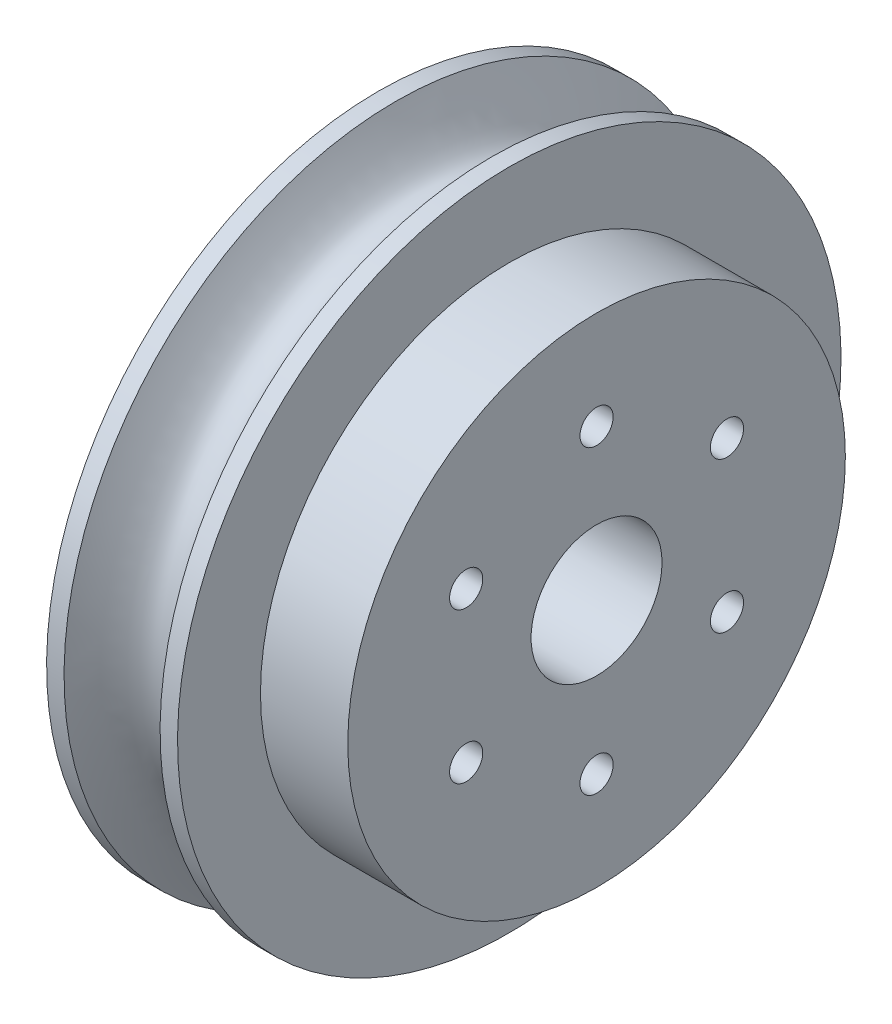
ISO-10303-21;
HEADER;
FILE_DESCRIPTION(('STEP AP214'),'2;1');
FILE_NAME('part.step','',(''),(''),'','','');
FILE_SCHEMA(('AUTOMOTIVE_DESIGN { 1 0 10303 214 1 1 1 1 }'));
ENDSEC;
DATA;
#1=APPLICATION_CONTEXT('core data for automotive mechanical design processes');
#2=APPLICATION_PROTOCOL_DEFINITION('international standard','automotive_design',2000,#1);
#3=PRODUCT_CONTEXT('',#1,'mechanical');
#4=PRODUCT('Part','Part','',(#3));
#5=PRODUCT_RELATED_PRODUCT_CATEGORY('part','',(#4));
#6=PRODUCT_DEFINITION_FORMATION('','',#4);
#7=PRODUCT_DEFINITION_CONTEXT('part definition',#1,'design');
#8=PRODUCT_DEFINITION('design','',#6,#7);
#9=PRODUCT_DEFINITION_SHAPE('','',#8);
#10=(LENGTH_UNIT() NAMED_UNIT(*) SI_UNIT(.MILLI.,.METRE.));
#11=(NAMED_UNIT(*) PLANE_ANGLE_UNIT() SI_UNIT($,.RADIAN.));
#12=(NAMED_UNIT(*) SI_UNIT($,.STERADIAN.) SOLID_ANGLE_UNIT());
#13=UNCERTAINTY_MEASURE_WITH_UNIT(LENGTH_MEASURE(1.E-05),#10,'distance_accuracy_value','');
#14=(GEOMETRIC_REPRESENTATION_CONTEXT(3) GLOBAL_UNCERTAINTY_ASSIGNED_CONTEXT((#13)) GLOBAL_UNIT_ASSIGNED_CONTEXT((#10,
#11,#12)) REPRESENTATION_CONTEXT('',''));
#15=CARTESIAN_POINT('',(0.,0.,0.));
#16=DIRECTION('',(0.,0.,1.));
#17=DIRECTION('',(1.,0.,0.));
#18=AXIS2_PLACEMENT_3D('',#15,#16,#17);
#19=CARTESIAN_POINT('',(10.,17.25,0.));
#20=DIRECTION('',(-1.,0.,0.));
#21=DIRECTION('',(0.,0.,1.));
#22=AXIS2_PLACEMENT_3D('',#19,#20,#21);
#23=CYLINDRICAL_SURFACE('',#22,1.9);
#24=CARTESIAN_POINT('',(10.,17.25,0.));
#25=DIRECTION('',(1.,0.,0.));
#26=DIRECTION('',(0.,0.,-1.));
#27=AXIS2_PLACEMENT_3D('',#24,#25,#26);
#28=CIRCLE('',#27,1.9);
#29=CARTESIAN_POINT('',(10.,17.25,-1.9));
#30=VERTEX_POINT('',#29);
#31=EDGE_CURVE('E49',#30,#30,#28,.T.);
#32=ORIENTED_EDGE('',*,*,#31,.T.);
#33=EDGE_LOOP('',(#32));
#34=FACE_BOUND('',#33,.T.);
#35=CARTESIAN_POINT('',(-10.,17.25,0.));
#36=DIRECTION('',(-1.,0.,0.));
#37=DIRECTION('',(0.,-1.,0.));
#38=AXIS2_PLACEMENT_3D('',#35,#36,#37);
#39=CIRCLE('',#38,1.9);
#40=CARTESIAN_POINT('',(-10.,15.35,0.));
#41=VERTEX_POINT('',#40);
#42=EDGE_CURVE('E44',#41,#41,#39,.T.);
#43=ORIENTED_EDGE('',*,*,#42,.T.);
#44=EDGE_LOOP('',(#43));
#45=FACE_BOUND('',#44,.T.);
#46=ADVANCED_FACE('F40',(#34,#45),#23,.F.);
#47=CARTESIAN_POINT('',(10.,8.62500000000001,-14.9389382152816));
#48=DIRECTION('',(-1.,0.,0.));
#49=DIRECTION('',(0.,0.,1.));
#50=AXIS2_PLACEMENT_3D('',#47,#48,#49);
#51=CYLINDRICAL_SURFACE('',#50,1.90000000000071);
#52=CARTESIAN_POINT('',(10.,8.62500000000001,-14.9389382152816));
#53=DIRECTION('',(1.,0.,0.));
#54=DIRECTION('',(0.,0.,-1.));
#55=AXIS2_PLACEMENT_3D('',#52,#53,#54);
#56=CIRCLE('',#55,1.90000000000071);
#57=CARTESIAN_POINT('',(10.,8.62500000000001,-16.8389382152823));
#58=VERTEX_POINT('',#57);
#59=EDGE_CURVE('E181',#58,#58,#56,.T.);
#60=ORIENTED_EDGE('',*,*,#59,.T.);
#61=EDGE_LOOP('',(#60));
#62=FACE_BOUND('',#61,.T.);
#63=CARTESIAN_POINT('',(-10.,8.62500000000001,-14.9389382152816));
#64=DIRECTION('',(-1.,0.,0.));
#65=DIRECTION('',(0.,-1.,0.));
#66=AXIS2_PLACEMENT_3D('',#63,#64,#65);
#67=CIRCLE('',#66,1.90000000000071);
#68=CARTESIAN_POINT('',(-10.,6.7249999999993,-14.9389382152816));
#69=VERTEX_POINT('',#68);
#70=EDGE_CURVE('E81',#69,#69,#67,.T.);
#71=ORIENTED_EDGE('',*,*,#70,.T.);
#72=EDGE_LOOP('',(#71));
#73=FACE_BOUND('',#72,.T.);
#74=ADVANCED_FACE('F149',(#62,#73),#51,.F.);
#75=CARTESIAN_POINT('',(10.,-8.625,-14.9389382152816));
#76=DIRECTION('',(-1.,0.,0.));
#77=DIRECTION('',(0.,0.,1.));
#78=AXIS2_PLACEMENT_3D('',#75,#76,#77);
#79=CYLINDRICAL_SURFACE('',#78,1.90000000000165);
#80=CARTESIAN_POINT('',(10.,-8.625,-14.9389382152816));
#81=DIRECTION('',(1.,0.,0.));
#82=DIRECTION('',(0.,0.,-1.));
#83=AXIS2_PLACEMENT_3D('',#80,#81,#82);
#84=CIRCLE('',#83,1.90000000000165);
#85=CARTESIAN_POINT('',(10.,-8.625,-16.8389382152832));
#86=VERTEX_POINT('',#85);
#87=EDGE_CURVE('E172',#86,#86,#84,.T.);
#88=ORIENTED_EDGE('',*,*,#87,.T.);
#89=EDGE_LOOP('',(#88));
#90=FACE_BOUND('',#89,.T.);
#91=CARTESIAN_POINT('',(-10.,-8.625,-14.9389382152816));
#92=DIRECTION('',(-1.,0.,0.));
#93=DIRECTION('',(0.,-1.,0.));
#94=AXIS2_PLACEMENT_3D('',#91,#92,#93);
#95=CIRCLE('',#94,1.90000000000165);
#96=CARTESIAN_POINT('',(-10.,-10.5250000000016,-14.9389382152816));
#97=VERTEX_POINT('',#96);
#98=EDGE_CURVE('E78',#97,#97,#95,.T.);
#99=ORIENTED_EDGE('',*,*,#98,.T.);
#100=EDGE_LOOP('',(#99));
#101=FACE_BOUND('',#100,.T.);
#102=ADVANCED_FACE('F145',(#90,#101),#79,.F.);
#103=CARTESIAN_POINT('',(10.,-17.25,0.));
#104=DIRECTION('',(-1.,0.,0.));
#105=DIRECTION('',(0.,0.,1.));
#106=AXIS2_PLACEMENT_3D('',#103,#104,#105);
#107=CYLINDRICAL_SURFACE('',#106,1.90000000000187);
#108=CARTESIAN_POINT('',(10.,-17.25,0.));
#109=DIRECTION('',(1.,0.,0.));
#110=DIRECTION('',(0.,0.,-1.));
#111=AXIS2_PLACEMENT_3D('',#108,#109,#110);
#112=CIRCLE('',#111,1.90000000000187);
#113=CARTESIAN_POINT('',(10.,-17.25,-1.90000000000187));
#114=VERTEX_POINT('',#113);
#115=EDGE_CURVE('E185',#114,#114,#112,.T.);
#116=ORIENTED_EDGE('',*,*,#115,.T.);
#117=EDGE_LOOP('',(#116));
#118=FACE_BOUND('',#117,.T.);
#119=CARTESIAN_POINT('',(-10.,-17.25,0.));
#120=DIRECTION('',(-1.,0.,0.));
#121=DIRECTION('',(0.,-1.,0.));
#122=AXIS2_PLACEMENT_3D('',#119,#120,#121);
#123=CIRCLE('',#122,1.90000000000187);
#124=CARTESIAN_POINT('',(-10.,-19.1500000000019,0.));
#125=VERTEX_POINT('',#124);
#126=EDGE_CURVE('E74',#125,#125,#123,.T.);
#127=ORIENTED_EDGE('',*,*,#126,.T.);
#128=EDGE_LOOP('',(#127));
#129=FACE_BOUND('',#128,.T.);
#130=ADVANCED_FACE('F141',(#118,#129),#107,.F.);
#131=CARTESIAN_POINT('',(10.,-8.62500000000001,14.9389382152816));
#132=DIRECTION('',(-1.,0.,0.));
#133=DIRECTION('',(0.,0.,1.));
#134=AXIS2_PLACEMENT_3D('',#131,#132,#133);
#135=CYLINDRICAL_SURFACE('',#134,1.90000000000115);
#136=CARTESIAN_POINT('',(10.,-8.62500000000001,14.9389382152816));
#137=DIRECTION('',(1.,0.,0.));
#138=DIRECTION('',(0.,0.,-1.));
#139=AXIS2_PLACEMENT_3D('',#136,#137,#138);
#140=CIRCLE('',#139,1.90000000000115);
#141=CARTESIAN_POINT('',(10.,-8.62500000000001,13.0389382152804));
#142=VERTEX_POINT('',#141);
#143=EDGE_CURVE('E168',#142,#142,#140,.T.);
#144=ORIENTED_EDGE('',*,*,#143,.T.);
#145=EDGE_LOOP('',(#144));
#146=FACE_BOUND('',#145,.T.);
#147=CARTESIAN_POINT('',(-10.,-8.62500000000001,14.9389382152816));
#148=DIRECTION('',(-1.,0.,0.));
#149=DIRECTION('',(0.,-1.,0.));
#150=AXIS2_PLACEMENT_3D('',#147,#148,#149);
#151=CIRCLE('',#150,1.90000000000115);
#152=CARTESIAN_POINT('',(-10.,-10.5250000000012,14.9389382152816));
#153=VERTEX_POINT('',#152);
#154=EDGE_CURVE('E69',#153,#153,#151,.T.);
#155=ORIENTED_EDGE('',*,*,#154,.T.);
#156=EDGE_LOOP('',(#155));
#157=FACE_BOUND('',#156,.T.);
#158=ADVANCED_FACE('F137',(#146,#157),#135,.F.);
#159=CARTESIAN_POINT('',(10.,8.62499999999999,14.9389382152816));
#160=DIRECTION('',(-1.,0.,0.));
#161=DIRECTION('',(0.,0.,1.));
#162=AXIS2_PLACEMENT_3D('',#159,#160,#161);
#163=CYLINDRICAL_SURFACE('',#162,1.90000000000022);
#164=CARTESIAN_POINT('',(10.,8.62499999999999,14.9389382152816));
#165=DIRECTION('',(1.,0.,0.));
#166=DIRECTION('',(0.,0.,-1.));
#167=AXIS2_PLACEMENT_3D('',#164,#165,#166);
#168=CIRCLE('',#167,1.90000000000022);
#169=CARTESIAN_POINT('',(10.,8.62499999999999,13.0389382152814));
#170=VERTEX_POINT('',#169);
#171=EDGE_CURVE('E63',#170,#170,#168,.T.);
#172=ORIENTED_EDGE('',*,*,#171,.T.);
#173=EDGE_LOOP('',(#172));
#174=FACE_BOUND('',#173,.T.);
#175=CARTESIAN_POINT('',(-10.,8.62499999999999,14.9389382152816));
#176=DIRECTION('',(-1.,0.,0.));
#177=DIRECTION('',(0.,-1.,0.));
#178=AXIS2_PLACEMENT_3D('',#175,#176,#177);
#179=CIRCLE('',#178,1.90000000000022);
#180=CARTESIAN_POINT('',(-10.,6.72499999999977,14.9389382152816));
#181=VERTEX_POINT('',#180);
#182=EDGE_CURVE('E65',#181,#181,#179,.T.);
#183=ORIENTED_EDGE('',*,*,#182,.T.);
#184=EDGE_LOOP('',(#183));
#185=FACE_BOUND('',#184,.T.);
#186=ADVANCED_FACE('F133',(#174,#185),#163,.F.);
#187=CARTESIAN_POINT('',(10.,0.,0.));
#188=DIRECTION('',(1.,0.,0.));
#189=DIRECTION('',(0.,0.,-1.));
#190=AXIS2_PLACEMENT_3D('',#187,#188,#189);
#191=PLANE('',#190);
#192=ORIENTED_EDGE('',*,*,#143,.F.);
#193=EDGE_LOOP('',(#192));
#194=FACE_BOUND('',#193,.T.);
#195=ORIENTED_EDGE('',*,*,#87,.F.);
#196=EDGE_LOOP('',(#195));
#197=FACE_BOUND('',#196,.T.);
#198=CARTESIAN_POINT('',(10.,0.,0.));
#199=DIRECTION('',(1.,0.,0.));
#200=DIRECTION('',(0.,0.,-1.));
#201=AXIS2_PLACEMENT_3D('',#198,#199,#200);
#202=CIRCLE('',#201,7.5);
#203=CARTESIAN_POINT('',(10.,0.,-7.5));
#204=VERTEX_POINT('',#203);
#205=EDGE_CURVE('E55',#204,#204,#202,.T.);
#206=ORIENTED_EDGE('',*,*,#205,.F.);
#207=EDGE_LOOP('',(#206));
#208=FACE_BOUND('',#207,.T.);
#209=CARTESIAN_POINT('',(10.,0.,0.));
#210=DIRECTION('',(1.,0.,0.));
#211=DIRECTION('',(0.,0.,-1.));
#212=AXIS2_PLACEMENT_3D('',#209,#210,#211);
#213=CIRCLE('',#212,28.5);
#214=CARTESIAN_POINT('',(10.,0.,-28.5));
#215=VERTEX_POINT('',#214);
#216=EDGE_CURVE('E10',#215,#215,#213,.T.);
#217=ORIENTED_EDGE('',*,*,#216,.T.);
#218=EDGE_LOOP('',(#217));
#219=FACE_BOUND('',#218,.T.);
#220=ORIENTED_EDGE('',*,*,#31,.F.);
#221=EDGE_LOOP('',(#220));
#222=FACE_BOUND('',#221,.T.);
#223=ORIENTED_EDGE('',*,*,#59,.F.);
#224=EDGE_LOOP('',(#223));
#225=FACE_BOUND('',#224,.T.);
#226=ORIENTED_EDGE('',*,*,#115,.F.);
#227=EDGE_LOOP('',(#226));
#228=FACE_BOUND('',#227,.T.);
#229=ORIENTED_EDGE('',*,*,#171,.F.);
#230=EDGE_LOOP('',(#229));
#231=FACE_BOUND('',#230,.T.);
#232=ADVANCED_FACE('F136',(#194,#197,#208,#219,#222,#225,#228,#231),#191,.T.);
#233=CARTESIAN_POINT('',(10.,0.,0.));
#234=DIRECTION('',(-1.,0.,0.));
#235=DIRECTION('',(0.,0.,1.));
#236=AXIS2_PLACEMENT_3D('',#233,#234,#235);
#237=CYLINDRICAL_SURFACE('',#236,28.5);
#238=ORIENTED_EDGE('',*,*,#216,.F.);
#239=EDGE_LOOP('',(#238));
#240=FACE_BOUND('',#239,.T.);
#241=CARTESIAN_POINT('',(0.,0.,0.));
#242=DIRECTION('',(1.,0.,0.));
#243=DIRECTION('',(0.,0.,-1.));
#244=AXIS2_PLACEMENT_3D('',#241,#242,#243);
#245=CIRCLE('',#244,28.5);
#246=CARTESIAN_POINT('',(0.,0.,-28.5));
#247=VERTEX_POINT('',#246);
#248=EDGE_CURVE('E59',#247,#247,#245,.T.);
#249=ORIENTED_EDGE('',*,*,#248,.T.);
#250=EDGE_LOOP('',(#249));
#251=FACE_BOUND('',#250,.T.);
#252=ADVANCED_FACE('F42',(#240,#251),#237,.T.);
#253=CARTESIAN_POINT('',(10.,0.,0.));
#254=DIRECTION('',(-1.,0.,0.));
#255=DIRECTION('',(0.,0.,1.));
#256=AXIS2_PLACEMENT_3D('',#253,#254,#255);
#257=CYLINDRICAL_SURFACE('',#256,7.5);
#258=ORIENTED_EDGE('',*,*,#205,.T.);
#259=EDGE_LOOP('',(#258));
#260=FACE_BOUND('',#259,.T.);
#261=CARTESIAN_POINT('',(-15.,0.,0.));
#262=DIRECTION('',(1.,0.,0.));
#263=DIRECTION('',(0.,0.,-1.));
#264=AXIS2_PLACEMENT_3D('',#261,#262,#263);
#265=CIRCLE('',#264,7.5);
#266=CARTESIAN_POINT('',(-15.,0.,-7.5));
#267=VERTEX_POINT('',#266);
#268=EDGE_CURVE('E88',#267,#267,#265,.T.);
#269=ORIENTED_EDGE('',*,*,#268,.F.);
#270=EDGE_LOOP('',(#269));
#271=FACE_BOUND('',#270,.T.);
#272=ADVANCED_FACE('F131',(#260,#271),#257,.F.);
#273=CARTESIAN_POINT('',(0.,38.,0.));
#274=DIRECTION('',(1.,0.,0.));
#275=DIRECTION('',(0.,1.,0.));
#276=AXIS2_PLACEMENT_3D('',#273,#274,#275);
#277=PLANE('',#276);
#278=ORIENTED_EDGE('',*,*,#248,.F.);
#279=EDGE_LOOP('',(#278));
#280=FACE_BOUND('',#279,.T.);
#281=CARTESIAN_POINT('',(0.,0.,0.));
#282=DIRECTION('',(1.,0.,0.));
#283=DIRECTION('',(0.,1.,0.));
#284=AXIS2_PLACEMENT_3D('',#281,#282,#283);
#285=CIRCLE('',#284,38.);
#286=CARTESIAN_POINT('',(0.,38.,0.));
#287=VERTEX_POINT('',#286);
#288=EDGE_CURVE('E93',#287,#287,#285,.T.);
#289=ORIENTED_EDGE('',*,*,#288,.T.);
#290=EDGE_LOOP('',(#289));
#291=FACE_BOUND('',#290,.T.);
#292=ADVANCED_FACE('F127',(#280,#291),#277,.T.);
#293=CARTESIAN_POINT('',(-15.,38.,0.));
#294=DIRECTION('',(-1.,0.,0.));
#295=DIRECTION('',(0.,-1.,0.));
#296=AXIS2_PLACEMENT_3D('',#293,#294,#295);
#297=PLANE('',#296);
#298=CARTESIAN_POINT('',(-15.,17.2499999999992,-4.88193243858465E-13));
#299=DIRECTION('',(-1.,0.,0.));
#300=DIRECTION('',(0.,-1.,0.));
#301=AXIS2_PLACEMENT_3D('',#298,#299,#300);
#302=CIRCLE('',#301,4.00000000000097);
#303=CARTESIAN_POINT('',(-15.,13.2499999999982,-4.88193243858465E-13));
#304=VERTEX_POINT('',#303);
#305=EDGE_CURVE('E240',#304,#304,#302,.T.);
#306=ORIENTED_EDGE('',*,*,#305,.F.);
#307=EDGE_LOOP('',(#306));
#308=FACE_BOUND('',#307,.T.);
#309=CARTESIAN_POINT('',(-15.,8.62499999999834,-14.9389382152816));
#310=DIRECTION('',(-1.,0.,0.));
#311=DIRECTION('',(0.,-1.,0.));
#312=AXIS2_PLACEMENT_3D('',#309,#310,#311);
#313=CIRCLE('',#312,4.00000000000116);
#314=CARTESIAN_POINT('',(-15.,4.62499999999717,-14.9389382152816));
#315=VERTEX_POINT('',#314);
#316=EDGE_CURVE('E232',#315,#315,#313,.T.);
#317=ORIENTED_EDGE('',*,*,#316,.F.);
#318=EDGE_LOOP('',(#317));
#319=FACE_BOUND('',#318,.T.);
#320=CARTESIAN_POINT('',(-15.,-8.62500000000167,-14.9389382152806));
#321=DIRECTION('',(-1.,0.,0.));
#322=DIRECTION('',(0.,-1.,0.));
#323=AXIS2_PLACEMENT_3D('',#320,#321,#322);
#324=CIRCLE('',#323,4.00000000000045);
#325=CARTESIAN_POINT('',(-15.,-12.6250000000021,-14.9389382152806));
#326=VERTEX_POINT('',#325);
#327=EDGE_CURVE('E217',#326,#326,#324,.T.);
#328=ORIENTED_EDGE('',*,*,#327,.F.);
#329=EDGE_LOOP('',(#328));
#330=FACE_BOUND('',#329,.T.);
#331=CARTESIAN_POINT('',(-15.,8.62499999999999,14.9389382152816));
#332=DIRECTION('',(-1.,0.,0.));
#333=DIRECTION('',(0.,-1.,0.));
#334=AXIS2_PLACEMENT_3D('',#331,#332,#333);
#335=CIRCLE('',#334,4.);
#336=CARTESIAN_POINT('',(-15.,4.62499999999999,14.9389382152816));
#337=VERTEX_POINT('',#336);
#338=EDGE_CURVE('E216',#337,#337,#335,.T.);
#339=ORIENTED_EDGE('',*,*,#338,.F.);
#340=EDGE_LOOP('',(#339));
#341=FACE_BOUND('',#340,.T.);
#342=CARTESIAN_POINT('',(-15.,-17.2500000000008,1.43275017652784E-12));
#343=DIRECTION('',(-1.,0.,0.));
#344=DIRECTION('',(0.,-1.,0.));
#345=AXIS2_PLACEMENT_3D('',#342,#343,#344);
#346=CIRCLE('',#345,3.99999999999952);
#347=CARTESIAN_POINT('',(-15.,-21.2500000000004,1.43275017652784E-12));
#348=VERTEX_POINT('',#347);
#349=EDGE_CURVE('E254',#348,#348,#346,.T.);
#350=ORIENTED_EDGE('',*,*,#349,.F.);
#351=EDGE_LOOP('',(#350));
#352=FACE_BOUND('',#351,.T.);
#353=CARTESIAN_POINT('',(-15.,-8.62500000000001,14.9389382152825));
#354=DIRECTION('',(-1.,0.,0.));
#355=DIRECTION('',(0.,-1.,0.));
#356=AXIS2_PLACEMENT_3D('',#353,#354,#355);
#357=CIRCLE('',#356,3.9999999999993);
#358=CARTESIAN_POINT('',(-15.,-12.6249999999993,14.9389382152825));
#359=VERTEX_POINT('',#358);
#360=EDGE_CURVE('E103',#359,#359,#357,.T.);
#361=ORIENTED_EDGE('',*,*,#360,.F.);
#362=EDGE_LOOP('',(#361));
#363=FACE_BOUND('',#362,.T.);
#364=ORIENTED_EDGE('',*,*,#268,.T.);
#365=EDGE_LOOP('',(#364));
#366=FACE_BOUND('',#365,.T.);
#367=CARTESIAN_POINT('',(-15.,0.,0.));
#368=DIRECTION('',(1.,0.,0.));
#369=DIRECTION('',(0.,1.,0.));
#370=AXIS2_PLACEMENT_3D('',#367,#368,#369);
#371=CIRCLE('',#370,38.);
#372=CARTESIAN_POINT('',(-15.,38.,0.));
#373=VERTEX_POINT('',#372);
#374=EDGE_CURVE('E64',#373,#373,#371,.T.);
#375=ORIENTED_EDGE('',*,*,#374,.F.);
#376=EDGE_LOOP('',(#375));
#377=FACE_BOUND('',#376,.T.);
#378=ADVANCED_FACE('F123',(#308,#319,#330,#341,#352,#363,#366,#377),#297,.T.);
#379=CARTESIAN_POINT('',(0.,0.,0.));
#380=DIRECTION('',(1.,0.,0.));
#381=DIRECTION('',(0.,1.,0.));
#382=AXIS2_PLACEMENT_3D('',#379,#380,#381);
#383=CYLINDRICAL_SURFACE('',#382,38.);
#384=ORIENTED_EDGE('',*,*,#374,.T.);
#385=EDGE_LOOP('',(#384));
#386=FACE_BOUND('',#385,.T.);
#387=CARTESIAN_POINT('',(-13.,0.,0.));
#388=DIRECTION('',(1.,0.,0.));
#389=DIRECTION('',(0.,1.,0.));
#390=AXIS2_PLACEMENT_3D('',#387,#388,#389);
#391=CIRCLE('',#390,38.);
#392=CARTESIAN_POINT('',(-13.,38.,0.));
#393=VERTEX_POINT('',#392);
#394=EDGE_CURVE('E281',#393,#393,#391,.T.);
#395=ORIENTED_EDGE('',*,*,#394,.F.);
#396=EDGE_LOOP('',(#395));
#397=FACE_BOUND('',#396,.T.);
#398=ADVANCED_FACE('F118',(#386,#397),#383,.T.);
#399=CARTESIAN_POINT('',(-2.,38.,0.));
#400=CARTESIAN_POINT('',(-5.0030564973437,32.05288023347,0.));
#401=CARTESIAN_POINT('',(-7.51549542219769,32.0193038111847,0.));
#402=CARTESIAN_POINT('',(-9.9770669763408,32.0395767366144,0.));
#403=CARTESIAN_POINT('',(-13.,38.,0.));
#404=B_SPLINE_CURVE_WITH_KNOTS('',3,(#399,#400,#401,#402,#403),.UNSPECIFIED.,.F.,.F.,(4,1,4),
(0.0480518872990736,0.499495068774425,0.951948112694929),.UNSPECIFIED.);
#405=CARTESIAN_POINT('',(0.,0.,0.));
#406=DIRECTION('',(1.,0.,0.));
#407=AXIS1_PLACEMENT('',#405,#406);
#408=SURFACE_OF_REVOLUTION('',#404,#407);
#409=ORIENTED_EDGE('',*,*,#394,.T.);
#410=EDGE_LOOP('',(#409));
#411=FACE_BOUND('',#410,.T.);
#412=CARTESIAN_POINT('',(-1.99999999999999,0.,0.));
#413=DIRECTION('',(1.,0.,0.));
#414=DIRECTION('',(0.,1.,0.));
#415=AXIS2_PLACEMENT_3D('',#412,#413,#414);
#416=CIRCLE('',#415,38.);
#417=CARTESIAN_POINT('',(-2.,38.,0.));
#418=VERTEX_POINT('',#417);
#419=EDGE_CURVE('E99',#418,#418,#416,.T.);
#420=ORIENTED_EDGE('',*,*,#419,.F.);
#421=EDGE_LOOP('',(#420));
#422=FACE_BOUND('',#421,.T.);
#423=ADVANCED_FACE('F113',(#411,#422),#408,.F.);
#424=CARTESIAN_POINT('',(0.,0.,0.));
#425=DIRECTION('',(1.,0.,0.));
#426=DIRECTION('',(0.,1.,0.));
#427=AXIS2_PLACEMENT_3D('',#424,#425,#426);
#428=CYLINDRICAL_SURFACE('',#427,38.);
#429=ORIENTED_EDGE('',*,*,#419,.T.);
#430=EDGE_LOOP('',(#429));
#431=FACE_BOUND('',#430,.T.);
#432=ORIENTED_EDGE('',*,*,#288,.F.);
#433=EDGE_LOOP('',(#432));
#434=FACE_BOUND('',#433,.T.);
#435=ADVANCED_FACE('F117',(#431,#434),#428,.T.);
#436=CARTESIAN_POINT('',(-9.99999999999999,-8.62500000000001,14.9389382152825));
#437=DIRECTION('',(-1.,0.,0.));
#438=DIRECTION('',(0.,-1.,0.));
#439=AXIS2_PLACEMENT_3D('',#436,#437,#438);
#440=CYLINDRICAL_SURFACE('',#439,3.9999999999993);
#441=CARTESIAN_POINT('',(-9.99999999999999,-8.62500000000001,14.9389382152825));
#442=DIRECTION('',(-1.,0.,0.));
#443=DIRECTION('',(0.,-1.,0.));
#444=AXIS2_PLACEMENT_3D('',#441,#442,#443);
#445=CIRCLE('',#444,3.9999999999993);
#446=CARTESIAN_POINT('',(-9.99999999999999,-12.6249999999993,14.9389382152825));
#447=VERTEX_POINT('',#446);
#448=EDGE_CURVE('E70',#447,#447,#445,.T.);
#449=ORIENTED_EDGE('',*,*,#448,.F.);
#450=EDGE_LOOP('',(#449));
#451=FACE_BOUND('',#450,.T.);
#452=ORIENTED_EDGE('',*,*,#360,.T.);
#453=EDGE_LOOP('',(#452));
#454=FACE_BOUND('',#453,.T.);
#455=ADVANCED_FACE('F292',(#451,#454),#440,.F.);
#456=CARTESIAN_POINT('',(-9.99999999999999,-8.62500000000001,14.9389382152825));
#457=DIRECTION('',(-1.,0.,0.));
#458=DIRECTION('',(0.,-1.,0.));
#459=AXIS2_PLACEMENT_3D('',#456,#457,#458);
#460=PLANE('',#459);
#461=ORIENTED_EDGE('',*,*,#154,.F.);
#462=EDGE_LOOP('',(#461));
#463=FACE_BOUND('',#462,.T.);
#464=ORIENTED_EDGE('',*,*,#448,.T.);
#465=EDGE_LOOP('',(#464));
#466=FACE_BOUND('',#465,.T.);
#467=ADVANCED_FACE('F298',(#463,#466),#460,.T.);
#468=CARTESIAN_POINT('',(-9.99999999999999,-17.2500000000008,1.43275017652784E-12));
#469=DIRECTION('',(-1.,0.,0.));
#470=DIRECTION('',(0.,-1.,0.));
#471=AXIS2_PLACEMENT_3D('',#468,#469,#470);
#472=CYLINDRICAL_SURFACE('',#471,3.99999999999952);
#473=CARTESIAN_POINT('',(-9.99999999999999,-17.2500000000008,1.43275017652784E-12));
#474=DIRECTION('',(-1.,0.,0.));
#475=DIRECTION('',(0.,-1.,0.));
#476=AXIS2_PLACEMENT_3D('',#473,#474,#475);
#477=CIRCLE('',#476,3.99999999999952);
#478=CARTESIAN_POINT('',(-9.99999999999999,-21.2500000000004,1.43275017652784E-12));
#479=VERTEX_POINT('',#478);
#480=EDGE_CURVE('E249',#479,#479,#477,.T.);
#481=ORIENTED_EDGE('',*,*,#480,.F.);
#482=EDGE_LOOP('',(#481));
#483=FACE_BOUND('',#482,.T.);
#484=ORIENTED_EDGE('',*,*,#349,.T.);
#485=EDGE_LOOP('',(#484));
#486=FACE_BOUND('',#485,.T.);
#487=ADVANCED_FACE('F303',(#483,#486),#472,.F.);
#488=CARTESIAN_POINT('',(-9.99999999999999,-17.2500000000008,1.43275017652784E-12));
#489=DIRECTION('',(-1.,0.,0.));
#490=DIRECTION('',(0.,-1.,0.));
#491=AXIS2_PLACEMENT_3D('',#488,#489,#490);
#492=PLANE('',#491);
#493=ORIENTED_EDGE('',*,*,#126,.F.);
#494=EDGE_LOOP('',(#493));
#495=FACE_BOUND('',#494,.T.);
#496=ORIENTED_EDGE('',*,*,#480,.T.);
#497=EDGE_LOOP('',(#496));
#498=FACE_BOUND('',#497,.T.);
#499=ADVANCED_FACE('F270',(#495,#498),#492,.T.);
#500=CARTESIAN_POINT('',(-10.,8.62499999999999,14.9389382152816));
#501=DIRECTION('',(-1.,0.,0.));
#502=DIRECTION('',(0.,-1.,0.));
#503=AXIS2_PLACEMENT_3D('',#500,#501,#502);
#504=CYLINDRICAL_SURFACE('',#503,4.);
#505=CARTESIAN_POINT('',(-10.,8.62499999999999,14.9389382152816));
#506=DIRECTION('',(-1.,0.,0.));
#507=DIRECTION('',(0.,-1.,0.));
#508=AXIS2_PLACEMENT_3D('',#505,#506,#507);
#509=CIRCLE('',#508,4.);
#510=CARTESIAN_POINT('',(-10.,4.62499999999999,14.9389382152816));
#511=VERTEX_POINT('',#510);
#512=EDGE_CURVE('E222',#511,#511,#509,.T.);
#513=ORIENTED_EDGE('',*,*,#512,.F.);
#514=EDGE_LOOP('',(#513));
#515=FACE_BOUND('',#514,.T.);
#516=ORIENTED_EDGE('',*,*,#338,.T.);
#517=EDGE_LOOP('',(#516));
#518=FACE_BOUND('',#517,.T.);
#519=ADVANCED_FACE('F267',(#515,#518),#504,.F.);
#520=CARTESIAN_POINT('',(-10.,8.62499999999999,14.9389382152816));
#521=DIRECTION('',(-1.,0.,0.));
#522=DIRECTION('',(0.,-1.,0.));
#523=AXIS2_PLACEMENT_3D('',#520,#521,#522);
#524=PLANE('',#523);
#525=ORIENTED_EDGE('',*,*,#182,.F.);
#526=EDGE_LOOP('',(#525));
#527=FACE_BOUND('',#526,.T.);
#528=ORIENTED_EDGE('',*,*,#512,.T.);
#529=EDGE_LOOP('',(#528));
#530=FACE_BOUND('',#529,.T.);
#531=ADVANCED_FACE('F265',(#527,#530),#524,.T.);
#532=CARTESIAN_POINT('',(-9.99999999999999,-8.62500000000167,-14.9389382152806));
#533=DIRECTION('',(-1.,0.,0.));
#534=DIRECTION('',(0.,-1.,0.));
#535=AXIS2_PLACEMENT_3D('',#532,#533,#534);
#536=CYLINDRICAL_SURFACE('',#535,4.00000000000045);
#537=CARTESIAN_POINT('',(-9.99999999999999,-8.62500000000167,-14.9389382152806));
#538=DIRECTION('',(-1.,0.,0.));
#539=DIRECTION('',(0.,-1.,0.));
#540=AXIS2_PLACEMENT_3D('',#537,#538,#539);
#541=CIRCLE('',#540,4.00000000000045);
#542=CARTESIAN_POINT('',(-9.99999999999999,-12.6250000000021,-14.9389382152806));
#543=VERTEX_POINT('',#542);
#544=EDGE_CURVE('E213',#543,#543,#541,.T.);
#545=ORIENTED_EDGE('',*,*,#544,.F.);
#546=EDGE_LOOP('',(#545));
#547=FACE_BOUND('',#546,.T.);
#548=ORIENTED_EDGE('',*,*,#327,.T.);
#549=EDGE_LOOP('',(#548));
#550=FACE_BOUND('',#549,.T.);
#551=ADVANCED_FACE('F209',(#547,#550),#536,.F.);
#552=CARTESIAN_POINT('',(-9.99999999999999,-8.62500000000167,-14.9389382152806));
#553=DIRECTION('',(-1.,0.,0.));
#554=DIRECTION('',(0.,-1.,0.));
#555=AXIS2_PLACEMENT_3D('',#552,#553,#554);
#556=PLANE('',#555);
#557=ORIENTED_EDGE('',*,*,#98,.F.);
#558=EDGE_LOOP('',(#557));
#559=FACE_BOUND('',#558,.T.);
#560=ORIENTED_EDGE('',*,*,#544,.T.);
#561=EDGE_LOOP('',(#560));
#562=FACE_BOUND('',#561,.T.);
#563=ADVANCED_FACE('F205',(#559,#562),#556,.T.);
#564=CARTESIAN_POINT('',(-10.,8.62499999999834,-14.9389382152816));
#565=DIRECTION('',(-1.,0.,0.));
#566=DIRECTION('',(0.,-1.,0.));
#567=AXIS2_PLACEMENT_3D('',#564,#565,#566);
#568=CYLINDRICAL_SURFACE('',#567,4.00000000000116);
#569=CARTESIAN_POINT('',(-10.,8.62499999999834,-14.9389382152816));
#570=DIRECTION('',(-1.,0.,0.));
#571=DIRECTION('',(0.,-1.,0.));
#572=AXIS2_PLACEMENT_3D('',#569,#570,#571);
#573=CIRCLE('',#572,4.00000000000116);
#574=CARTESIAN_POINT('',(-10.,4.62499999999717,-14.9389382152816));
#575=VERTEX_POINT('',#574);
#576=EDGE_CURVE('E225',#575,#575,#573,.T.);
#577=ORIENTED_EDGE('',*,*,#576,.F.);
#578=EDGE_LOOP('',(#577));
#579=FACE_BOUND('',#578,.T.);
#580=ORIENTED_EDGE('',*,*,#316,.T.);
#581=EDGE_LOOP('',(#580));
#582=FACE_BOUND('',#581,.T.);
#583=ADVANCED_FACE('F208',(#579,#582),#568,.F.);
#584=CARTESIAN_POINT('',(-10.,8.62499999999834,-14.9389382152816));
#585=DIRECTION('',(-1.,0.,0.));
#586=DIRECTION('',(0.,-1.,0.));
#587=AXIS2_PLACEMENT_3D('',#584,#585,#586);
#588=PLANE('',#587);
#589=ORIENTED_EDGE('',*,*,#70,.F.);
#590=EDGE_LOOP('',(#589));
#591=FACE_BOUND('',#590,.T.);
#592=ORIENTED_EDGE('',*,*,#576,.T.);
#593=EDGE_LOOP('',(#592));
#594=FACE_BOUND('',#593,.T.);
#595=ADVANCED_FACE('F311',(#591,#594),#588,.T.);
#596=CARTESIAN_POINT('',(-10.,17.2499999999992,-4.88193243858465E-13));
#597=DIRECTION('',(-1.,0.,0.));
#598=DIRECTION('',(0.,-1.,0.));
#599=AXIS2_PLACEMENT_3D('',#596,#597,#598);
#600=CYLINDRICAL_SURFACE('',#599,4.00000000000097);
#601=CARTESIAN_POINT('',(-10.,17.2499999999992,-4.88193243858465E-13));
#602=DIRECTION('',(-1.,0.,0.));
#603=DIRECTION('',(0.,-1.,0.));
#604=AXIS2_PLACEMENT_3D('',#601,#602,#603);
#605=CIRCLE('',#604,4.00000000000097);
#606=CARTESIAN_POINT('',(-10.,13.2499999999982,-4.88193243858465E-13));
#607=VERTEX_POINT('',#606);
#608=EDGE_CURVE('E236',#607,#607,#605,.T.);
#609=ORIENTED_EDGE('',*,*,#608,.F.);
#610=EDGE_LOOP('',(#609));
#611=FACE_BOUND('',#610,.T.);
#612=ORIENTED_EDGE('',*,*,#305,.T.);
#613=EDGE_LOOP('',(#612));
#614=FACE_BOUND('',#613,.T.);
#615=ADVANCED_FACE('F307',(#611,#614),#600,.F.);
#616=CARTESIAN_POINT('',(-10.,17.2499999999992,-4.88193243858465E-13));
#617=DIRECTION('',(-1.,0.,0.));
#618=DIRECTION('',(0.,-1.,0.));
#619=AXIS2_PLACEMENT_3D('',#616,#617,#618);
#620=PLANE('',#619);
#621=ORIENTED_EDGE('',*,*,#42,.F.);
#622=EDGE_LOOP('',(#621));
#623=FACE_BOUND('',#622,.T.);
#624=ORIENTED_EDGE('',*,*,#608,.T.);
#625=EDGE_LOOP('',(#624));
#626=FACE_BOUND('',#625,.T.);
#627=ADVANCED_FACE('F310',(#623,#626),#620,.T.);
#628=CLOSED_SHELL('',(#46,#74,#102,#130,#158,#186,#232,#252,#272,#292,#378,#398,#423,#435,#455,
#467,#487,#499,#519,#531,#551,#563,#583,#595,#615,#627));
#629=MANIFOLD_SOLID_BREP('B2',#628);
#630=ADVANCED_BREP_SHAPE_REPRESENTATION('',(#18,#629),#14);
#631=SHAPE_DEFINITION_REPRESENTATION(#9,#630);
ENDSEC;
END-ISO-10303-21;
